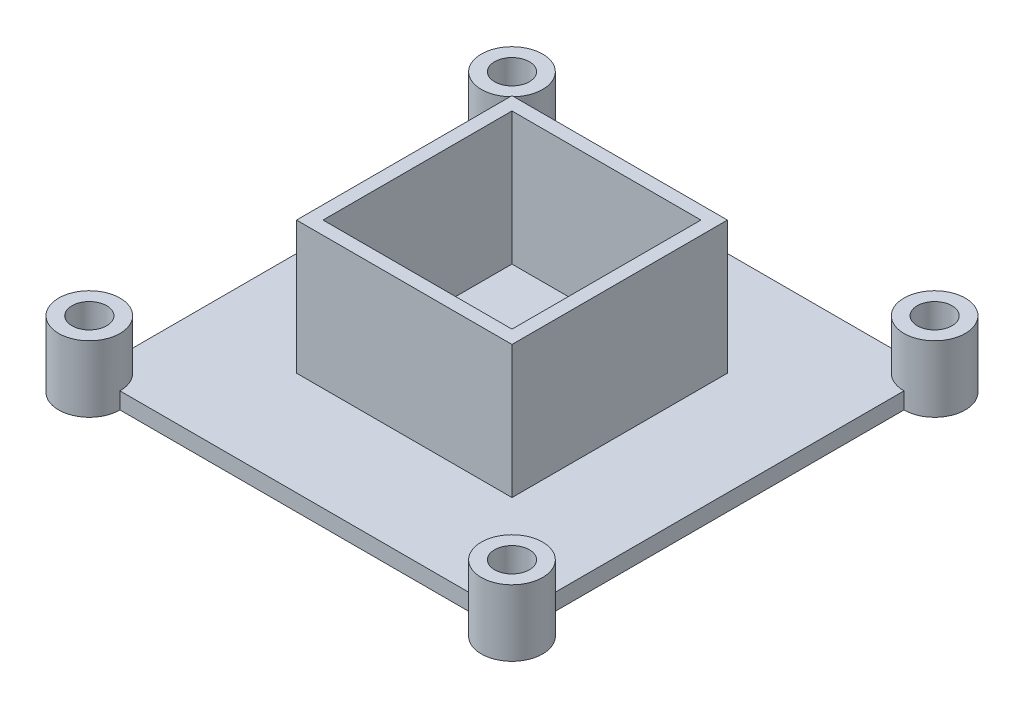
ISO-10303-21;
HEADER;
FILE_DESCRIPTION(('STEP AP214'),'2;1');
FILE_NAME('part.step','',(''),(''),'','','');
FILE_SCHEMA(('AUTOMOTIVE_DESIGN { 1 0 10303 214 1 1 1 1 }'));
ENDSEC;
DATA;
#1=APPLICATION_CONTEXT('core data for automotive mechanical design processes');
#2=APPLICATION_PROTOCOL_DEFINITION('international standard','automotive_design',2000,#1);
#3=PRODUCT_CONTEXT('',#1,'mechanical');
#4=PRODUCT('Part','Part','',(#3));
#5=PRODUCT_RELATED_PRODUCT_CATEGORY('part','',(#4));
#6=PRODUCT_DEFINITION_FORMATION('','',#4);
#7=PRODUCT_DEFINITION_CONTEXT('part definition',#1,'design');
#8=PRODUCT_DEFINITION('design','',#6,#7);
#9=PRODUCT_DEFINITION_SHAPE('','',#8);
#10=(LENGTH_UNIT() NAMED_UNIT(*) SI_UNIT(.MILLI.,.METRE.));
#11=(NAMED_UNIT(*) PLANE_ANGLE_UNIT() SI_UNIT($,.RADIAN.));
#12=(NAMED_UNIT(*) SI_UNIT($,.STERADIAN.) SOLID_ANGLE_UNIT());
#13=UNCERTAINTY_MEASURE_WITH_UNIT(LENGTH_MEASURE(1.E-05),#10,'distance_accuracy_value','');
#14=(GEOMETRIC_REPRESENTATION_CONTEXT(3) GLOBAL_UNCERTAINTY_ASSIGNED_CONTEXT((#13)) GLOBAL_UNIT_ASSIGNED_CONTEXT((#10,
#11,#12)) REPRESENTATION_CONTEXT('',''));
#15=CARTESIAN_POINT('',(0.,0.,0.));
#16=DIRECTION('',(0.,0.,1.));
#17=DIRECTION('',(1.,0.,0.));
#18=AXIS2_PLACEMENT_3D('',#15,#16,#17);
#19=CARTESIAN_POINT('',(0.,0.,0.));
#20=DIRECTION('',(0.,1.,0.));
#21=DIRECTION('',(0.,0.,1.));
#22=AXIS2_PLACEMENT_3D('',#19,#20,#21);
#23=PLANE('',#22);
#24=CARTESIAN_POINT('',(15.,0.,-15.));
#25=DIRECTION('',(0.,1.,0.));
#26=DIRECTION('',(0.,0.,1.));
#27=AXIS2_PLACEMENT_3D('',#24,#25,#26);
#28=CIRCLE('',#27,1.85);
#29=CARTESIAN_POINT('',(13.15,0.,-15.));
#30=VERTEX_POINT('',#29);
#31=CARTESIAN_POINT('',(15.,0.,-13.15));
#32=VERTEX_POINT('',#31);
#33=EDGE_CURVE('E12',#30,#32,#28,.T.);
#34=ORIENTED_EDGE('',*,*,#33,.F.);
#35=DIRECTION('',(1.,0.,0.));
#36=VECTOR('',#35,1.);
#37=CARTESIAN_POINT('',(0.,0.,-15.));
#38=LINE('',#37,#36);
#39=CARTESIAN_POINT('',(-8.65,0.,-15.));
#40=VERTEX_POINT('',#39);
#41=EDGE_CURVE('E358',#40,#30,#38,.T.);
#42=ORIENTED_EDGE('',*,*,#41,.F.);
#43=CARTESIAN_POINT('',(-10.5,0.,-15.));
#44=DIRECTION('',(0.,1.,0.));
#45=DIRECTION('',(0.,0.,1.));
#46=AXIS2_PLACEMENT_3D('',#43,#44,#45);
#47=CIRCLE('',#46,1.85);
#48=CARTESIAN_POINT('',(-10.5,0.,-13.15));
#49=VERTEX_POINT('',#48);
#50=EDGE_CURVE('E281',#49,#40,#47,.T.);
#51=ORIENTED_EDGE('',*,*,#50,.F.);
#52=DIRECTION('',(0.,0.,-1.));
#53=VECTOR('',#52,1.);
#54=CARTESIAN_POINT('',(-10.5,0.,0.));
#55=LINE('',#54,#53);
#56=CARTESIAN_POINT('',(-10.5,0.,8.65));
#57=VERTEX_POINT('',#56);
#58=EDGE_CURVE('E324',#57,#49,#55,.T.);
#59=ORIENTED_EDGE('',*,*,#58,.F.);
#60=CARTESIAN_POINT('',(-10.5,0.,10.5));
#61=DIRECTION('',(0.,1.,0.));
#62=DIRECTION('',(0.,0.,1.));
#63=AXIS2_PLACEMENT_3D('',#60,#61,#62);
#64=CIRCLE('',#63,1.85);
#65=CARTESIAN_POINT('',(-8.65,0.,10.5));
#66=VERTEX_POINT('',#65);
#67=EDGE_CURVE('E300',#66,#57,#64,.T.);
#68=ORIENTED_EDGE('',*,*,#67,.F.);
#69=DIRECTION('',(1.,0.,0.));
#70=VECTOR('',#69,1.);
#71=CARTESIAN_POINT('',(0.,0.,10.5));
#72=LINE('',#71,#70);
#73=CARTESIAN_POINT('',(13.15,0.,10.5));
#74=VERTEX_POINT('',#73);
#75=EDGE_CURVE('E313',#66,#74,#72,.T.);
#76=ORIENTED_EDGE('',*,*,#75,.T.);
#77=CARTESIAN_POINT('',(15.,0.,10.5));
#78=DIRECTION('',(0.,1.,0.));
#79=DIRECTION('',(0.,0.,1.));
#80=AXIS2_PLACEMENT_3D('',#77,#78,#79);
#81=CIRCLE('',#80,1.85);
#82=CARTESIAN_POINT('',(15.,0.,8.65));
#83=VERTEX_POINT('',#82);
#84=EDGE_CURVE('E297',#83,#74,#81,.T.);
#85=ORIENTED_EDGE('',*,*,#84,.F.);
#86=DIRECTION('',(0.,0.,-1.));
#87=VECTOR('',#86,1.);
#88=CARTESIAN_POINT('',(15.,0.,0.));
#89=LINE('',#88,#87);
#90=EDGE_CURVE('E351',#83,#32,#89,.T.);
#91=ORIENTED_EDGE('',*,*,#90,.T.);
#92=EDGE_LOOP('',(#34,#42,#51,#59,#68,#76,#85,#91));
#93=FACE_BOUND('',#92,.T.);
#94=DIRECTION('',(1.,0.,0.));
#95=VECTOR('',#94,1.);
#96=CARTESIAN_POINT('',(8.75,0.,4.24999999999999));
#97=LINE('',#96,#95);
#98=CARTESIAN_POINT('',(-4.25,0.,4.25));
#99=VERTEX_POINT('',#98);
#100=CARTESIAN_POINT('',(8.75,0.,4.24999999999999));
#101=VERTEX_POINT('',#100);
#102=EDGE_CURVE('E268',#99,#101,#97,.T.);
#103=ORIENTED_EDGE('',*,*,#102,.F.);
#104=DIRECTION('',(0.,0.,1.));
#105=VECTOR('',#104,1.);
#106=CARTESIAN_POINT('',(-4.25,0.,4.25));
#107=LINE('',#106,#105);
#108=CARTESIAN_POINT('',(-4.25,0.,-8.75));
#109=VERTEX_POINT('',#108);
#110=EDGE_CURVE('E232',#109,#99,#107,.T.);
#111=ORIENTED_EDGE('',*,*,#110,.F.);
#112=DIRECTION('',(-1.,0.,0.));
#113=VECTOR('',#112,1.);
#114=CARTESIAN_POINT('',(8.75,0.,-8.75));
#115=LINE('',#114,#113);
#116=CARTESIAN_POINT('',(8.75,0.,-8.75));
#117=VERTEX_POINT('',#116);
#118=EDGE_CURVE('E262',#117,#109,#115,.T.);
#119=ORIENTED_EDGE('',*,*,#118,.F.);
#120=DIRECTION('',(0.,0.,-1.));
#121=VECTOR('',#120,1.);
#122=CARTESIAN_POINT('',(8.75,0.,4.24999999999999));
#123=LINE('',#122,#121);
#124=EDGE_CURVE('E275',#101,#117,#123,.T.);
#125=ORIENTED_EDGE('',*,*,#124,.F.);
#126=EDGE_LOOP('',(#103,#111,#119,#125));
#127=FACE_BOUND('',#126,.T.);
#128=ADVANCED_FACE('F103',(#93,#127),#23,.T.);
#129=CARTESIAN_POINT('',(15.,-1.,10.5));
#130=DIRECTION('',(0.,1.,0.));
#131=DIRECTION('',(0.,0.,1.));
#132=AXIS2_PLACEMENT_3D('',#129,#130,#131);
#133=CYLINDRICAL_SURFACE('',#132,1.05);
#134=CARTESIAN_POINT('',(15.,-1.,10.5));
#135=DIRECTION('',(0.,1.,0.));
#136=DIRECTION('',(0.,0.,1.));
#137=AXIS2_PLACEMENT_3D('',#134,#135,#136);
#138=CIRCLE('',#137,1.05);
#139=CARTESIAN_POINT('',(15.,-1.,11.55));
#140=VERTEX_POINT('',#139);
#141=EDGE_CURVE('E346',#140,#140,#138,.T.);
#142=ORIENTED_EDGE('',*,*,#141,.F.);
#143=EDGE_LOOP('',(#142));
#144=FACE_BOUND('',#143,.T.);
#145=CARTESIAN_POINT('',(15.,3.,10.5));
#146=DIRECTION('',(0.,1.,0.));
#147=DIRECTION('',(0.,0.,1.));
#148=AXIS2_PLACEMENT_3D('',#145,#146,#147);
#149=CIRCLE('',#148,1.05);
#150=CARTESIAN_POINT('',(15.,3.,11.55));
#151=VERTEX_POINT('',#150);
#152=EDGE_CURVE('E311',#151,#151,#149,.T.);
#153=ORIENTED_EDGE('',*,*,#152,.T.);
#154=EDGE_LOOP('',(#153));
#155=FACE_BOUND('',#154,.T.);
#156=ADVANCED_FACE('F417',(#144,#155),#133,.F.);
#157=CARTESIAN_POINT('',(15.,-1.,10.5));
#158=DIRECTION('',(0.,1.,0.));
#159=DIRECTION('',(0.,0.,1.));
#160=AXIS2_PLACEMENT_3D('',#157,#158,#159);
#161=CYLINDRICAL_SURFACE('',#160,1.85);
#162=DIRECTION('',(0.,1.,0.));
#163=VECTOR('',#162,1.);
#164=CARTESIAN_POINT('',(15.,-1.,8.65));
#165=LINE('',#164,#163);
#166=CARTESIAN_POINT('',(15.,-1.,8.65));
#167=VERTEX_POINT('',#166);
#168=EDGE_CURVE('E375',#167,#83,#165,.T.);
#169=ORIENTED_EDGE('',*,*,#168,.T.);
#170=ORIENTED_EDGE('',*,*,#84,.T.);
#171=DIRECTION('',(0.,1.,0.));
#172=VECTOR('',#171,1.);
#173=CARTESIAN_POINT('',(13.15,-1.,10.5));
#174=LINE('',#173,#172);
#175=CARTESIAN_POINT('',(13.15,-1.,10.5));
#176=VERTEX_POINT('',#175);
#177=EDGE_CURVE('E372',#176,#74,#174,.T.);
#178=ORIENTED_EDGE('',*,*,#177,.F.);
#179=CARTESIAN_POINT('',(15.,-1.,10.5));
#180=DIRECTION('',(0.,1.,0.));
#181=DIRECTION('',(0.,0.,1.));
#182=AXIS2_PLACEMENT_3D('',#179,#180,#181);
#183=CIRCLE('',#182,1.85);
#184=EDGE_CURVE('E323',#176,#167,#183,.T.);
#185=ORIENTED_EDGE('',*,*,#184,.T.);
#186=EDGE_LOOP('',(#169,#170,#178,#185));
#187=FACE_BOUND('',#186,.T.);
#188=CARTESIAN_POINT('',(15.,3.,10.5));
#189=DIRECTION('',(0.,1.,0.));
#190=DIRECTION('',(0.,0.,1.));
#191=AXIS2_PLACEMENT_3D('',#188,#189,#190);
#192=CIRCLE('',#191,1.85);
#193=CARTESIAN_POINT('',(15.,3.,12.35));
#194=VERTEX_POINT('',#193);
#195=EDGE_CURVE('E308',#194,#194,#192,.T.);
#196=ORIENTED_EDGE('',*,*,#195,.F.);
#197=EDGE_LOOP('',(#196));
#198=FACE_BOUND('',#197,.T.);
#199=ADVANCED_FACE('F425',(#187,#198),#161,.T.);
#200=CARTESIAN_POINT('',(-10.5,-1.,-15.));
#201=DIRECTION('',(0.,1.,0.));
#202=DIRECTION('',(0.,0.,1.));
#203=AXIS2_PLACEMENT_3D('',#200,#201,#202);
#204=CYLINDRICAL_SURFACE('',#203,1.05);
#205=CARTESIAN_POINT('',(-10.5,-1.,-15.));
#206=DIRECTION('',(0.,1.,0.));
#207=DIRECTION('',(0.,0.,1.));
#208=AXIS2_PLACEMENT_3D('',#205,#206,#207);
#209=CIRCLE('',#208,1.05);
#210=CARTESIAN_POINT('',(-10.5,-1.,-13.95));
#211=VERTEX_POINT('',#210);
#212=EDGE_CURVE('E347',#211,#211,#209,.T.);
#213=ORIENTED_EDGE('',*,*,#212,.F.);
#214=EDGE_LOOP('',(#213));
#215=FACE_BOUND('',#214,.T.);
#216=CARTESIAN_POINT('',(-10.5,3.,-15.));
#217=DIRECTION('',(0.,1.,0.));
#218=DIRECTION('',(0.,0.,1.));
#219=AXIS2_PLACEMENT_3D('',#216,#217,#218);
#220=CIRCLE('',#219,1.05);
#221=CARTESIAN_POINT('',(-10.5,3.,-13.95));
#222=VERTEX_POINT('',#221);
#223=EDGE_CURVE('E285',#222,#222,#220,.T.);
#224=ORIENTED_EDGE('',*,*,#223,.T.);
#225=EDGE_LOOP('',(#224));
#226=FACE_BOUND('',#225,.T.);
#227=ADVANCED_FACE('F494',(#215,#226),#204,.F.);
#228=CARTESIAN_POINT('',(15.,-1.,-15.));
#229=DIRECTION('',(0.,1.,0.));
#230=DIRECTION('',(0.,0.,1.));
#231=AXIS2_PLACEMENT_3D('',#228,#229,#230);
#232=CYLINDRICAL_SURFACE('',#231,1.05);
#233=CARTESIAN_POINT('',(15.,-1.,-15.));
#234=DIRECTION('',(0.,1.,0.));
#235=DIRECTION('',(0.,0.,1.));
#236=AXIS2_PLACEMENT_3D('',#233,#234,#235);
#237=CIRCLE('',#236,1.05);
#238=CARTESIAN_POINT('',(15.,-1.,-13.95));
#239=VERTEX_POINT('',#238);
#240=EDGE_CURVE('E345',#239,#239,#237,.T.);
#241=ORIENTED_EDGE('',*,*,#240,.F.);
#242=EDGE_LOOP('',(#241));
#243=FACE_BOUND('',#242,.T.);
#244=CARTESIAN_POINT('',(15.,3.,-15.));
#245=DIRECTION('',(0.,1.,0.));
#246=DIRECTION('',(0.,0.,1.));
#247=AXIS2_PLACEMENT_3D('',#244,#245,#246);
#248=CIRCLE('',#247,1.05);
#249=CARTESIAN_POINT('',(15.,3.,-13.95));
#250=VERTEX_POINT('',#249);
#251=EDGE_CURVE('E298',#250,#250,#248,.T.);
#252=ORIENTED_EDGE('',*,*,#251,.T.);
#253=EDGE_LOOP('',(#252));
#254=FACE_BOUND('',#253,.T.);
#255=ADVANCED_FACE('F412',(#243,#254),#232,.F.);
#256=CARTESIAN_POINT('',(-10.5,-1.,10.5));
#257=DIRECTION('',(0.,1.,0.));
#258=DIRECTION('',(0.,0.,1.));
#259=AXIS2_PLACEMENT_3D('',#256,#257,#258);
#260=CYLINDRICAL_SURFACE('',#259,1.05);
#261=CARTESIAN_POINT('',(-10.5,-1.,10.5));
#262=DIRECTION('',(0.,1.,0.));
#263=DIRECTION('',(0.,0.,1.));
#264=AXIS2_PLACEMENT_3D('',#261,#262,#263);
#265=CIRCLE('',#264,1.05);
#266=CARTESIAN_POINT('',(-10.5,-1.,11.55));
#267=VERTEX_POINT('',#266);
#268=EDGE_CURVE('E338',#267,#267,#265,.T.);
#269=ORIENTED_EDGE('',*,*,#268,.F.);
#270=EDGE_LOOP('',(#269));
#271=FACE_BOUND('',#270,.T.);
#272=CARTESIAN_POINT('',(-10.5,3.,10.5));
#273=DIRECTION('',(0.,1.,0.));
#274=DIRECTION('',(0.,0.,1.));
#275=AXIS2_PLACEMENT_3D('',#272,#273,#274);
#276=CIRCLE('',#275,1.05);
#277=CARTESIAN_POINT('',(-10.5,3.,11.55));
#278=VERTEX_POINT('',#277);
#279=EDGE_CURVE('E290',#278,#278,#276,.T.);
#280=ORIENTED_EDGE('',*,*,#279,.T.);
#281=EDGE_LOOP('',(#280));
#282=FACE_BOUND('',#281,.T.);
#283=ADVANCED_FACE('F409',(#271,#282),#260,.F.);
#284=CARTESIAN_POINT('',(0.,-1.,10.5));
#285=DIRECTION('',(0.,0.,1.));
#286=DIRECTION('',(1.,0.,0.));
#287=AXIS2_PLACEMENT_3D('',#284,#285,#286);
#288=PLANE('',#287);
#289=ORIENTED_EDGE('',*,*,#75,.F.);
#290=DIRECTION('',(0.,1.,0.));
#291=VECTOR('',#290,1.);
#292=CARTESIAN_POINT('',(-8.65,-1.,10.5));
#293=LINE('',#292,#291);
#294=CARTESIAN_POINT('',(-8.65,-1.,10.5));
#295=VERTEX_POINT('',#294);
#296=EDGE_CURVE('E102',#295,#66,#293,.T.);
#297=ORIENTED_EDGE('',*,*,#296,.F.);
#298=DIRECTION('',(1.,0.,0.));
#299=VECTOR('',#298,1.);
#300=CARTESIAN_POINT('',(0.,-1.,10.5));
#301=LINE('',#300,#299);
#302=EDGE_CURVE('E318',#295,#176,#301,.T.);
#303=ORIENTED_EDGE('',*,*,#302,.T.);
#304=ORIENTED_EDGE('',*,*,#177,.T.);
#305=EDGE_LOOP('',(#289,#297,#303,#304));
#306=FACE_BOUND('',#305,.T.);
#307=ADVANCED_FACE('F404',(#306),#288,.T.);
#308=CARTESIAN_POINT('',(-10.5,-1.,10.5));
#309=DIRECTION('',(0.,1.,0.));
#310=DIRECTION('',(0.,0.,1.));
#311=AXIS2_PLACEMENT_3D('',#308,#309,#310);
#312=CYLINDRICAL_SURFACE('',#311,1.85);
#313=ORIENTED_EDGE('',*,*,#296,.T.);
#314=ORIENTED_EDGE('',*,*,#67,.T.);
#315=DIRECTION('',(0.,1.,0.));
#316=VECTOR('',#315,1.);
#317=CARTESIAN_POINT('',(-10.5,-1.,8.65));
#318=LINE('',#317,#316);
#319=CARTESIAN_POINT('',(-10.5,-1.,8.65));
#320=VERTEX_POINT('',#319);
#321=EDGE_CURVE('E109',#320,#57,#318,.T.);
#322=ORIENTED_EDGE('',*,*,#321,.F.);
#323=CARTESIAN_POINT('',(-10.5,-1.,10.5));
#324=DIRECTION('',(0.,1.,0.));
#325=DIRECTION('',(0.,0.,1.));
#326=AXIS2_PLACEMENT_3D('',#323,#324,#325);
#327=CIRCLE('',#326,1.85);
#328=EDGE_CURVE('E320',#320,#295,#327,.T.);
#329=ORIENTED_EDGE('',*,*,#328,.T.);
#330=EDGE_LOOP('',(#313,#314,#322,#329));
#331=FACE_BOUND('',#330,.T.);
#332=CARTESIAN_POINT('',(-10.5,3.,10.5));
#333=DIRECTION('',(0.,1.,0.));
#334=DIRECTION('',(0.,0.,1.));
#335=AXIS2_PLACEMENT_3D('',#332,#333,#334);
#336=CIRCLE('',#335,1.85);
#337=CARTESIAN_POINT('',(-10.5,3.,12.35));
#338=VERTEX_POINT('',#337);
#339=EDGE_CURVE('E303',#338,#338,#336,.T.);
#340=ORIENTED_EDGE('',*,*,#339,.F.);
#341=EDGE_LOOP('',(#340));
#342=FACE_BOUND('',#341,.T.);
#343=ADVANCED_FACE('F101',(#331,#342),#312,.T.);
#344=CARTESIAN_POINT('',(-10.5,-1.,0.));
#345=DIRECTION('',(1.,0.,0.));
#346=DIRECTION('',(0.,0.,-1.));
#347=AXIS2_PLACEMENT_3D('',#344,#345,#346);
#348=PLANE('',#347);
#349=ORIENTED_EDGE('',*,*,#58,.T.);
#350=DIRECTION('',(0.,1.,0.));
#351=VECTOR('',#350,1.);
#352=CARTESIAN_POINT('',(-10.5,-1.,-13.15));
#353=LINE('',#352,#351);
#354=CARTESIAN_POINT('',(-10.5,-1.,-13.15));
#355=VERTEX_POINT('',#354);
#356=EDGE_CURVE('E363',#355,#49,#353,.T.);
#357=ORIENTED_EDGE('',*,*,#356,.F.);
#358=DIRECTION('',(0.,0.,-1.));
#359=VECTOR('',#358,1.);
#360=CARTESIAN_POINT('',(-10.5,-1.,0.));
#361=LINE('',#360,#359);
#362=EDGE_CURVE('E336',#320,#355,#361,.T.);
#363=ORIENTED_EDGE('',*,*,#362,.F.);
#364=ORIENTED_EDGE('',*,*,#321,.T.);
#365=EDGE_LOOP('',(#349,#357,#363,#364));
#366=FACE_BOUND('',#365,.T.);
#367=ADVANCED_FACE('F387',(#366),#348,.F.);
#368=CARTESIAN_POINT('',(-10.5,-1.,-15.));
#369=DIRECTION('',(0.,1.,0.));
#370=DIRECTION('',(0.,0.,1.));
#371=AXIS2_PLACEMENT_3D('',#368,#369,#370);
#372=CYLINDRICAL_SURFACE('',#371,1.85);
#373=ORIENTED_EDGE('',*,*,#356,.T.);
#374=ORIENTED_EDGE('',*,*,#50,.T.);
#375=DIRECTION('',(0.,1.,0.));
#376=VECTOR('',#375,1.);
#377=CARTESIAN_POINT('',(-8.65,-1.,-15.));
#378=LINE('',#377,#376);
#379=CARTESIAN_POINT('',(-8.65,-1.,-15.));
#380=VERTEX_POINT('',#379);
#381=EDGE_CURVE('E364',#380,#40,#378,.T.);
#382=ORIENTED_EDGE('',*,*,#381,.F.);
#383=CARTESIAN_POINT('',(-10.5,-1.,-15.));
#384=DIRECTION('',(0.,1.,0.));
#385=DIRECTION('',(0.,0.,1.));
#386=AXIS2_PLACEMENT_3D('',#383,#384,#385);
#387=CIRCLE('',#386,1.85);
#388=EDGE_CURVE('E333',#380,#355,#387,.T.);
#389=ORIENTED_EDGE('',*,*,#388,.T.);
#390=EDGE_LOOP('',(#373,#374,#382,#389));
#391=FACE_BOUND('',#390,.T.);
#392=CARTESIAN_POINT('',(-10.5,3.,-15.));
#393=DIRECTION('',(0.,1.,0.));
#394=DIRECTION('',(0.,0.,1.));
#395=AXIS2_PLACEMENT_3D('',#392,#393,#394);
#396=CIRCLE('',#395,1.85);
#397=CARTESIAN_POINT('',(-10.5,3.,-13.15));
#398=VERTEX_POINT('',#397);
#399=EDGE_CURVE('E289',#398,#398,#396,.T.);
#400=ORIENTED_EDGE('',*,*,#399,.F.);
#401=EDGE_LOOP('',(#400));
#402=FACE_BOUND('',#401,.T.);
#403=ADVANCED_FACE('F395',(#391,#402),#372,.T.);
#404=CARTESIAN_POINT('',(0.,-1.,-15.));
#405=DIRECTION('',(0.,0.,1.));
#406=DIRECTION('',(1.,0.,0.));
#407=AXIS2_PLACEMENT_3D('',#404,#405,#406);
#408=PLANE('',#407);
#409=ORIENTED_EDGE('',*,*,#41,.T.);
#410=DIRECTION('',(0.,1.,0.));
#411=VECTOR('',#410,1.);
#412=CARTESIAN_POINT('',(13.15,-1.,-15.));
#413=LINE('',#412,#411);
#414=CARTESIAN_POINT('',(13.15,-1.,-15.));
#415=VERTEX_POINT('',#414);
#416=EDGE_CURVE('E366',#415,#30,#413,.T.);
#417=ORIENTED_EDGE('',*,*,#416,.F.);
#418=DIRECTION('',(1.,0.,0.));
#419=VECTOR('',#418,1.);
#420=CARTESIAN_POINT('',(0.,-1.,-15.));
#421=LINE('',#420,#419);
#422=EDGE_CURVE('E334',#380,#415,#421,.T.);
#423=ORIENTED_EDGE('',*,*,#422,.F.);
#424=ORIENTED_EDGE('',*,*,#381,.T.);
#425=EDGE_LOOP('',(#409,#417,#423,#424));
#426=FACE_BOUND('',#425,.T.);
#427=ADVANCED_FACE('F490',(#426),#408,.F.);
#428=CARTESIAN_POINT('',(15.,-1.,-15.));
#429=DIRECTION('',(0.,1.,0.));
#430=DIRECTION('',(0.,0.,1.));
#431=AXIS2_PLACEMENT_3D('',#428,#429,#430);
#432=CYLINDRICAL_SURFACE('',#431,1.85);
#433=ORIENTED_EDGE('',*,*,#416,.T.);
#434=ORIENTED_EDGE('',*,*,#33,.T.);
#435=DIRECTION('',(0.,1.,0.));
#436=VECTOR('',#435,1.);
#437=CARTESIAN_POINT('',(15.,-1.,-13.15));
#438=LINE('',#437,#436);
#439=CARTESIAN_POINT('',(15.,-1.,-13.15));
#440=VERTEX_POINT('',#439);
#441=EDGE_CURVE('E367',#440,#32,#438,.T.);
#442=ORIENTED_EDGE('',*,*,#441,.F.);
#443=CARTESIAN_POINT('',(15.,-1.,-15.));
#444=DIRECTION('',(0.,1.,0.));
#445=DIRECTION('',(0.,0.,1.));
#446=AXIS2_PLACEMENT_3D('',#443,#444,#445);
#447=CIRCLE('',#446,1.85);
#448=EDGE_CURVE('E328',#440,#415,#447,.T.);
#449=ORIENTED_EDGE('',*,*,#448,.T.);
#450=EDGE_LOOP('',(#433,#434,#442,#449));
#451=FACE_BOUND('',#450,.T.);
#452=CARTESIAN_POINT('',(15.,3.,-15.));
#453=DIRECTION('',(0.,1.,0.));
#454=DIRECTION('',(0.,0.,1.));
#455=AXIS2_PLACEMENT_3D('',#452,#453,#454);
#456=CIRCLE('',#455,1.85);
#457=CARTESIAN_POINT('',(15.,3.,-13.15));
#458=VERTEX_POINT('',#457);
#459=EDGE_CURVE('E291',#458,#458,#456,.T.);
#460=ORIENTED_EDGE('',*,*,#459,.F.);
#461=EDGE_LOOP('',(#460));
#462=FACE_BOUND('',#461,.T.);
#463=ADVANCED_FACE('F484',(#451,#462),#432,.T.);
#464=CARTESIAN_POINT('',(15.,-1.,0.));
#465=DIRECTION('',(1.,0.,0.));
#466=DIRECTION('',(0.,0.,-1.));
#467=AXIS2_PLACEMENT_3D('',#464,#465,#466);
#468=PLANE('',#467);
#469=ORIENTED_EDGE('',*,*,#90,.F.);
#470=ORIENTED_EDGE('',*,*,#168,.F.);
#471=DIRECTION('',(0.,0.,-1.));
#472=VECTOR('',#471,1.);
#473=CARTESIAN_POINT('',(15.,-1.,0.));
#474=LINE('',#473,#472);
#475=EDGE_CURVE('E329',#167,#440,#474,.T.);
#476=ORIENTED_EDGE('',*,*,#475,.T.);
#477=ORIENTED_EDGE('',*,*,#441,.T.);
#478=EDGE_LOOP('',(#469,#470,#476,#477));
#479=FACE_BOUND('',#478,.T.);
#480=ADVANCED_FACE('F476',(#479),#468,.T.);
#481=CARTESIAN_POINT('',(0.,-1.,0.));
#482=DIRECTION('',(0.,1.,0.));
#483=DIRECTION('',(0.,0.,1.));
#484=AXIS2_PLACEMENT_3D('',#481,#482,#483);
#485=PLANE('',#484);
#486=ORIENTED_EDGE('',*,*,#475,.F.);
#487=ORIENTED_EDGE('',*,*,#184,.F.);
#488=ORIENTED_EDGE('',*,*,#302,.F.);
#489=ORIENTED_EDGE('',*,*,#328,.F.);
#490=ORIENTED_EDGE('',*,*,#362,.T.);
#491=ORIENTED_EDGE('',*,*,#388,.F.);
#492=ORIENTED_EDGE('',*,*,#422,.T.);
#493=ORIENTED_EDGE('',*,*,#448,.F.);
#494=EDGE_LOOP('',(#486,#487,#488,#489,#490,#491,#492,#493));
#495=FACE_BOUND('',#494,.T.);
#496=ORIENTED_EDGE('',*,*,#268,.T.);
#497=EDGE_LOOP('',(#496));
#498=FACE_BOUND('',#497,.T.);
#499=ORIENTED_EDGE('',*,*,#240,.T.);
#500=EDGE_LOOP('',(#499));
#501=FACE_BOUND('',#500,.T.);
#502=ORIENTED_EDGE('',*,*,#212,.T.);
#503=EDGE_LOOP('',(#502));
#504=FACE_BOUND('',#503,.T.);
#505=ORIENTED_EDGE('',*,*,#141,.T.);
#506=EDGE_LOOP('',(#505));
#507=FACE_BOUND('',#506,.T.);
#508=ADVANCED_FACE('F396',(#495,#498,#501,#504,#507),#485,.F.);
#509=CARTESIAN_POINT('',(0.,3.,0.));
#510=DIRECTION('',(0.,1.,0.));
#511=DIRECTION('',(0.,0.,1.));
#512=AXIS2_PLACEMENT_3D('',#509,#510,#511);
#513=PLANE('',#512);
#514=ORIENTED_EDGE('',*,*,#195,.T.);
#515=EDGE_LOOP('',(#514));
#516=FACE_BOUND('',#515,.T.);
#517=ORIENTED_EDGE('',*,*,#152,.F.);
#518=EDGE_LOOP('',(#517));
#519=FACE_BOUND('',#518,.T.);
#520=ADVANCED_FACE('F469',(#516,#519),#513,.T.);
#521=CARTESIAN_POINT('',(0.,3.,0.));
#522=DIRECTION('',(0.,1.,0.));
#523=DIRECTION('',(0.,0.,1.));
#524=AXIS2_PLACEMENT_3D('',#521,#522,#523);
#525=PLANE('',#524);
#526=ORIENTED_EDGE('',*,*,#399,.T.);
#527=EDGE_LOOP('',(#526));
#528=FACE_BOUND('',#527,.T.);
#529=ORIENTED_EDGE('',*,*,#223,.F.);
#530=EDGE_LOOP('',(#529));
#531=FACE_BOUND('',#530,.T.);
#532=ADVANCED_FACE('F463',(#528,#531),#525,.T.);
#533=CARTESIAN_POINT('',(0.,3.,0.));
#534=DIRECTION('',(0.,1.,0.));
#535=DIRECTION('',(0.,0.,1.));
#536=AXIS2_PLACEMENT_3D('',#533,#534,#535);
#537=PLANE('',#536);
#538=ORIENTED_EDGE('',*,*,#339,.T.);
#539=EDGE_LOOP('',(#538));
#540=FACE_BOUND('',#539,.T.);
#541=ORIENTED_EDGE('',*,*,#279,.F.);
#542=EDGE_LOOP('',(#541));
#543=FACE_BOUND('',#542,.T.);
#544=ADVANCED_FACE('F466',(#540,#543),#537,.T.);
#545=CARTESIAN_POINT('',(0.,3.,0.));
#546=DIRECTION('',(0.,1.,0.));
#547=DIRECTION('',(0.,0.,1.));
#548=AXIS2_PLACEMENT_3D('',#545,#546,#547);
#549=PLANE('',#548);
#550=ORIENTED_EDGE('',*,*,#251,.F.);
#551=EDGE_LOOP('',(#550));
#552=FACE_BOUND('',#551,.T.);
#553=ORIENTED_EDGE('',*,*,#459,.T.);
#554=EDGE_LOOP('',(#553));
#555=FACE_BOUND('',#554,.T.);
#556=ADVANCED_FACE('F448',(#552,#555),#549,.T.);
#557=CARTESIAN_POINT('',(0.,8.,0.));
#558=DIRECTION('',(0.,1.,0.));
#559=DIRECTION('',(0.,0.,1.));
#560=AXIS2_PLACEMENT_3D('',#557,#558,#559);
#561=PLANE('',#560);
#562=DIRECTION('',(0.,0.,1.));
#563=VECTOR('',#562,1.);
#564=CARTESIAN_POINT('',(-4.25,8.,4.25));
#565=LINE('',#564,#563);
#566=CARTESIAN_POINT('',(-4.25,8.,-8.75));
#567=VERTEX_POINT('',#566);
#568=CARTESIAN_POINT('',(-4.25,8.,4.25));
#569=VERTEX_POINT('',#568);
#570=EDGE_CURVE('E256',#567,#569,#565,.T.);
#571=ORIENTED_EDGE('',*,*,#570,.T.);
#572=DIRECTION('',(1.,0.,0.));
#573=VECTOR('',#572,1.);
#574=CARTESIAN_POINT('',(8.75,8.,4.24999999999999));
#575=LINE('',#574,#573);
#576=CARTESIAN_POINT('',(8.75,8.,4.24999999999999));
#577=VERTEX_POINT('',#576);
#578=EDGE_CURVE('E257',#569,#577,#575,.T.);
#579=ORIENTED_EDGE('',*,*,#578,.T.);
#580=DIRECTION('',(0.,0.,-1.));
#581=VECTOR('',#580,1.);
#582=CARTESIAN_POINT('',(8.75,8.,4.24999999999999));
#583=LINE('',#582,#581);
#584=CARTESIAN_POINT('',(8.75,8.,-8.75));
#585=VERTEX_POINT('',#584);
#586=EDGE_CURVE('E265',#577,#585,#583,.T.);
#587=ORIENTED_EDGE('',*,*,#586,.T.);
#588=DIRECTION('',(-1.,0.,0.));
#589=VECTOR('',#588,1.);
#590=CARTESIAN_POINT('',(8.75,8.,-8.75));
#591=LINE('',#590,#589);
#592=EDGE_CURVE('E263',#585,#567,#591,.T.);
#593=ORIENTED_EDGE('',*,*,#592,.T.);
#594=EDGE_LOOP('',(#571,#579,#587,#593));
#595=FACE_BOUND('',#594,.T.);
#596=DIRECTION('',(0.,0.,-1.));
#597=VECTOR('',#596,1.);
#598=CARTESIAN_POINT('',(7.95,8.,3.45));
#599=LINE('',#598,#597);
#600=CARTESIAN_POINT('',(7.95,8.,3.45));
#601=VERTEX_POINT('',#600);
#602=CARTESIAN_POINT('',(7.95,8.,-7.95));
#603=VERTEX_POINT('',#602);
#604=EDGE_CURVE('E227',#601,#603,#599,.T.);
#605=ORIENTED_EDGE('',*,*,#604,.F.);
#606=DIRECTION('',(1.,0.,0.));
#607=VECTOR('',#606,1.);
#608=CARTESIAN_POINT('',(7.95,8.,3.45));
#609=LINE('',#608,#607);
#610=CARTESIAN_POINT('',(-3.45,8.,3.45));
#611=VERTEX_POINT('',#610);
#612=EDGE_CURVE('E220',#611,#601,#609,.T.);
#613=ORIENTED_EDGE('',*,*,#612,.F.);
#614=DIRECTION('',(0.,0.,1.));
#615=VECTOR('',#614,1.);
#616=CARTESIAN_POINT('',(-3.45,8.,3.45));
#617=LINE('',#616,#615);
#618=CARTESIAN_POINT('',(-3.45,8.,-7.95));
#619=VERTEX_POINT('',#618);
#620=EDGE_CURVE('E243',#619,#611,#617,.T.);
#621=ORIENTED_EDGE('',*,*,#620,.F.);
#622=DIRECTION('',(-1.,0.,0.));
#623=VECTOR('',#622,1.);
#624=CARTESIAN_POINT('',(7.95,8.,-7.95));
#625=LINE('',#624,#623);
#626=EDGE_CURVE('E241',#603,#619,#625,.T.);
#627=ORIENTED_EDGE('',*,*,#626,.F.);
#628=EDGE_LOOP('',(#605,#613,#621,#627));
#629=FACE_BOUND('',#628,.T.);
#630=ADVANCED_FACE('F237',(#595,#629),#561,.T.);
#631=CARTESIAN_POINT('',(-4.25,8.,4.25));
#632=DIRECTION('',(1.,0.,0.));
#633=DIRECTION('',(0.,0.,-1.));
#634=AXIS2_PLACEMENT_3D('',#631,#632,#633);
#635=PLANE('',#634);
#636=ORIENTED_EDGE('',*,*,#110,.T.);
#637=DIRECTION('',(0.,-1.,0.));
#638=VECTOR('',#637,1.);
#639=CARTESIAN_POINT('',(-4.25,8.,4.25));
#640=LINE('',#639,#638);
#641=EDGE_CURVE('E282',#569,#99,#640,.T.);
#642=ORIENTED_EDGE('',*,*,#641,.F.);
#643=ORIENTED_EDGE('',*,*,#570,.F.);
#644=DIRECTION('',(0.,-1.,0.));
#645=VECTOR('',#644,1.);
#646=CARTESIAN_POINT('',(-4.25,8.,-8.75));
#647=LINE('',#646,#645);
#648=EDGE_CURVE('E270',#567,#109,#647,.T.);
#649=ORIENTED_EDGE('',*,*,#648,.T.);
#650=EDGE_LOOP('',(#636,#642,#643,#649));
#651=FACE_BOUND('',#650,.T.);
#652=ADVANCED_FACE('F446',(#651),#635,.F.);
#653=CARTESIAN_POINT('',(8.75,8.,4.24999999999999));
#654=DIRECTION('',(0.,0.,-1.));
#655=DIRECTION('',(-1.,0.,0.));
#656=AXIS2_PLACEMENT_3D('',#653,#654,#655);
#657=PLANE('',#656);
#658=ORIENTED_EDGE('',*,*,#102,.T.);
#659=DIRECTION('',(0.,-1.,0.));
#660=VECTOR('',#659,1.);
#661=CARTESIAN_POINT('',(8.75,8.,4.24999999999999));
#662=LINE('',#661,#660);
#663=EDGE_CURVE('E280',#577,#101,#662,.T.);
#664=ORIENTED_EDGE('',*,*,#663,.F.);
#665=ORIENTED_EDGE('',*,*,#578,.F.);
#666=ORIENTED_EDGE('',*,*,#641,.T.);
#667=EDGE_LOOP('',(#658,#664,#665,#666));
#668=FACE_BOUND('',#667,.T.);
#669=ADVANCED_FACE('F459',(#668),#657,.F.);
#670=CARTESIAN_POINT('',(8.75,8.,4.24999999999999));
#671=DIRECTION('',(-1.,0.,0.));
#672=DIRECTION('',(0.,0.,1.));
#673=AXIS2_PLACEMENT_3D('',#670,#671,#672);
#674=PLANE('',#673);
#675=ORIENTED_EDGE('',*,*,#124,.T.);
#676=DIRECTION('',(0.,-1.,0.));
#677=VECTOR('',#676,1.);
#678=CARTESIAN_POINT('',(8.75,8.,-8.75));
#679=LINE('',#678,#677);
#680=EDGE_CURVE('E117',#585,#117,#679,.T.);
#681=ORIENTED_EDGE('',*,*,#680,.F.);
#682=ORIENTED_EDGE('',*,*,#586,.F.);
#683=ORIENTED_EDGE('',*,*,#663,.T.);
#684=EDGE_LOOP('',(#675,#681,#682,#683));
#685=FACE_BOUND('',#684,.T.);
#686=ADVANCED_FACE('F453',(#685),#674,.F.);
#687=CARTESIAN_POINT('',(8.75,8.,-8.75));
#688=DIRECTION('',(0.,0.,1.));
#689=DIRECTION('',(1.,0.,0.));
#690=AXIS2_PLACEMENT_3D('',#687,#688,#689);
#691=PLANE('',#690);
#692=ORIENTED_EDGE('',*,*,#118,.T.);
#693=ORIENTED_EDGE('',*,*,#648,.F.);
#694=ORIENTED_EDGE('',*,*,#592,.F.);
#695=ORIENTED_EDGE('',*,*,#680,.T.);
#696=EDGE_LOOP('',(#692,#693,#694,#695));
#697=FACE_BOUND('',#696,.T.);
#698=ADVANCED_FACE('F450',(#697),#691,.F.);
#699=CARTESIAN_POINT('',(7.95,8.,3.45));
#700=DIRECTION('',(0.,0.,-1.));
#701=DIRECTION('',(-1.,0.,0.));
#702=AXIS2_PLACEMENT_3D('',#699,#700,#701);
#703=PLANE('',#702);
#704=DIRECTION('',(1.,0.,0.));
#705=VECTOR('',#704,1.);
#706=CARTESIAN_POINT('',(7.95,0.,3.45));
#707=LINE('',#706,#705);
#708=CARTESIAN_POINT('',(-3.45,0.,3.45));
#709=VERTEX_POINT('',#708);
#710=CARTESIAN_POINT('',(7.95,0.,3.45));
#711=VERTEX_POINT('',#710);
#712=EDGE_CURVE('E129',#709,#711,#707,.T.);
#713=ORIENTED_EDGE('',*,*,#712,.F.);
#714=DIRECTION('',(0.,-1.,0.));
#715=VECTOR('',#714,1.);
#716=CARTESIAN_POINT('',(-3.45,8.,3.45));
#717=LINE('',#716,#715);
#718=EDGE_CURVE('E224',#611,#709,#717,.T.);
#719=ORIENTED_EDGE('',*,*,#718,.F.);
#720=ORIENTED_EDGE('',*,*,#612,.T.);
#721=DIRECTION('',(0.,-1.,0.));
#722=VECTOR('',#721,1.);
#723=CARTESIAN_POINT('',(7.95,8.,3.45));
#724=LINE('',#723,#722);
#725=EDGE_CURVE('E222',#601,#711,#724,.T.);
#726=ORIENTED_EDGE('',*,*,#725,.T.);
#727=EDGE_LOOP('',(#713,#719,#720,#726));
#728=FACE_BOUND('',#727,.T.);
#729=ADVANCED_FACE('F218',(#728),#703,.T.);
#730=CARTESIAN_POINT('',(7.95,8.,3.45));
#731=DIRECTION('',(-1.,0.,0.));
#732=DIRECTION('',(0.,0.,1.));
#733=AXIS2_PLACEMENT_3D('',#730,#731,#732);
#734=PLANE('',#733);
#735=DIRECTION('',(0.,0.,-1.));
#736=VECTOR('',#735,1.);
#737=CARTESIAN_POINT('',(7.95,0.,3.45));
#738=LINE('',#737,#736);
#739=CARTESIAN_POINT('',(7.95,0.,-7.95));
#740=VERTEX_POINT('',#739);
#741=EDGE_CURVE('E234',#711,#740,#738,.T.);
#742=ORIENTED_EDGE('',*,*,#741,.F.);
#743=ORIENTED_EDGE('',*,*,#725,.F.);
#744=ORIENTED_EDGE('',*,*,#604,.T.);
#745=DIRECTION('',(0.,-1.,0.));
#746=VECTOR('',#745,1.);
#747=CARTESIAN_POINT('',(7.95,8.,-7.95));
#748=LINE('',#747,#746);
#749=EDGE_CURVE('E236',#603,#740,#748,.T.);
#750=ORIENTED_EDGE('',*,*,#749,.T.);
#751=EDGE_LOOP('',(#742,#743,#744,#750));
#752=FACE_BOUND('',#751,.T.);
#753=ADVANCED_FACE('F233',(#752),#734,.T.);
#754=CARTESIAN_POINT('',(7.95,8.,-7.95));
#755=DIRECTION('',(0.,0.,1.));
#756=DIRECTION('',(1.,0.,0.));
#757=AXIS2_PLACEMENT_3D('',#754,#755,#756);
#758=PLANE('',#757);
#759=DIRECTION('',(-1.,0.,0.));
#760=VECTOR('',#759,1.);
#761=CARTESIAN_POINT('',(7.95,0.,-7.95));
#762=LINE('',#761,#760);
#763=CARTESIAN_POINT('',(-3.45,0.,-7.95));
#764=VERTEX_POINT('',#763);
#765=EDGE_CURVE('E248',#740,#764,#762,.T.);
#766=ORIENTED_EDGE('',*,*,#765,.F.);
#767=ORIENTED_EDGE('',*,*,#749,.F.);
#768=ORIENTED_EDGE('',*,*,#626,.T.);
#769=DIRECTION('',(0.,-1.,0.));
#770=VECTOR('',#769,1.);
#771=CARTESIAN_POINT('',(-3.45,8.,-7.95));
#772=LINE('',#771,#770);
#773=EDGE_CURVE('E254',#619,#764,#772,.T.);
#774=ORIENTED_EDGE('',*,*,#773,.T.);
#775=EDGE_LOOP('',(#766,#767,#768,#774));
#776=FACE_BOUND('',#775,.T.);
#777=ADVANCED_FACE('F433',(#776),#758,.T.);
#778=CARTESIAN_POINT('',(-3.45,8.,3.45));
#779=DIRECTION('',(1.,0.,0.));
#780=DIRECTION('',(0.,0.,-1.));
#781=AXIS2_PLACEMENT_3D('',#778,#779,#780);
#782=PLANE('',#781);
#783=DIRECTION('',(0.,0.,1.));
#784=VECTOR('',#783,1.);
#785=CARTESIAN_POINT('',(-3.45,0.,3.45));
#786=LINE('',#785,#784);
#787=EDGE_CURVE('E226',#764,#709,#786,.T.);
#788=ORIENTED_EDGE('',*,*,#787,.F.);
#789=ORIENTED_EDGE('',*,*,#773,.F.);
#790=ORIENTED_EDGE('',*,*,#620,.T.);
#791=ORIENTED_EDGE('',*,*,#718,.T.);
#792=EDGE_LOOP('',(#788,#789,#790,#791));
#793=FACE_BOUND('',#792,.T.);
#794=ADVANCED_FACE('F429',(#793),#782,.T.);
#795=ORIENTED_EDGE('',*,*,#712,.T.);
#796=ORIENTED_EDGE('',*,*,#741,.T.);
#797=ORIENTED_EDGE('',*,*,#765,.T.);
#798=ORIENTED_EDGE('',*,*,#787,.T.);
#799=EDGE_LOOP('',(#795,#796,#797,#798));
#800=FACE_BOUND('',#799,.T.);
#801=ADVANCED_FACE('F419',(#800),#23,.T.);
#802=CLOSED_SHELL('',(#128,#156,#199,#227,#255,#283,#307,#343,#367,#403,#427,#463,#480,#508,
#520,#532,#544,#556,#630,#652,#669,#686,#698,#729,#753,#777,#794,#801));
#803=MANIFOLD_SOLID_BREP('B2',#802);
#804=ADVANCED_BREP_SHAPE_REPRESENTATION('',(#18,#803),#14);
#805=SHAPE_DEFINITION_REPRESENTATION(#9,#804);
ENDSEC;
END-ISO-10303-21;
